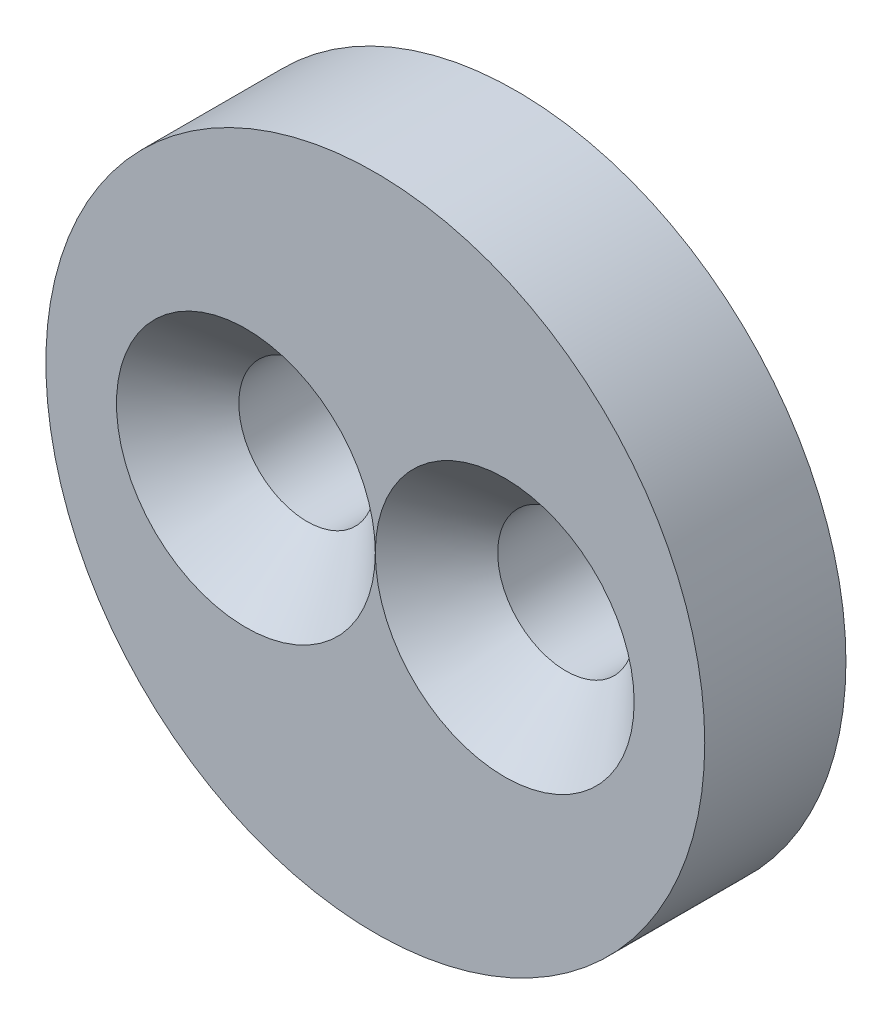
ISO-10303-21;
HEADER;
FILE_DESCRIPTION(('STEP AP214'),'2;1');
FILE_NAME('part.step','',(''),(''),'','','');
FILE_SCHEMA(('AUTOMOTIVE_DESIGN { 1 0 10303 214 1 1 1 1 }'));
ENDSEC;
DATA;
#1=APPLICATION_CONTEXT('core data for automotive mechanical design processes');
#2=APPLICATION_PROTOCOL_DEFINITION('international standard','automotive_design',2000,#1);
#3=PRODUCT_CONTEXT('',#1,'mechanical');
#4=PRODUCT('Part','Part','',(#3));
#5=PRODUCT_RELATED_PRODUCT_CATEGORY('part','',(#4));
#6=PRODUCT_DEFINITION_FORMATION('','',#4);
#7=PRODUCT_DEFINITION_CONTEXT('part definition',#1,'design');
#8=PRODUCT_DEFINITION('design','',#6,#7);
#9=PRODUCT_DEFINITION_SHAPE('','',#8);
#10=(LENGTH_UNIT() NAMED_UNIT(*) SI_UNIT(.MILLI.,.METRE.));
#11=(NAMED_UNIT(*) PLANE_ANGLE_UNIT() SI_UNIT($,.RADIAN.));
#12=(NAMED_UNIT(*) SI_UNIT($,.STERADIAN.) SOLID_ANGLE_UNIT());
#13=UNCERTAINTY_MEASURE_WITH_UNIT(LENGTH_MEASURE(1.E-05),#10,'distance_accuracy_value','');
#14=(GEOMETRIC_REPRESENTATION_CONTEXT(3) GLOBAL_UNCERTAINTY_ASSIGNED_CONTEXT((#13)) GLOBAL_UNIT_ASSIGNED_CONTEXT((#10,
#11,#12)) REPRESENTATION_CONTEXT('',''));
#15=CARTESIAN_POINT('',(0.,0.,0.));
#16=DIRECTION('',(0.,0.,1.));
#17=DIRECTION('',(1.,0.,0.));
#18=AXIS2_PLACEMENT_3D('',#15,#16,#17);
#19=CARTESIAN_POINT('',(0.,0.,30.299999999999));
#20=DIRECTION('',(0.,0.,-1.));
#21=DIRECTION('',(-1.,0.,0.));
#22=AXIS2_PLACEMENT_3D('',#19,#20,#21);
#23=CYLINDRICAL_SURFACE('',#22,7.);
#24=CARTESIAN_POINT('',(0.,0.,30.299999999999));
#25=DIRECTION('',(0.,0.,1.));
#26=DIRECTION('',(1.,0.,0.));
#27=AXIS2_PLACEMENT_3D('',#24,#25,#26);
#28=CIRCLE('',#27,7.);
#29=CARTESIAN_POINT('',(7.00000000000001,0.,30.299999999999));
#30=VERTEX_POINT('',#29);
#31=EDGE_CURVE('E11',#30,#30,#28,.T.);
#32=ORIENTED_EDGE('',*,*,#31,.F.);
#33=EDGE_LOOP('',(#32));
#34=FACE_BOUND('',#33,.T.);
#35=CARTESIAN_POINT('',(0.,0.,27.299999999999));
#36=DIRECTION('',(0.,0.,1.));
#37=DIRECTION('',(1.,0.,0.));
#38=AXIS2_PLACEMENT_3D('',#35,#36,#37);
#39=CIRCLE('',#38,7.);
#40=CARTESIAN_POINT('',(7.00000000000001,0.,27.299999999999));
#41=VERTEX_POINT('',#40);
#42=EDGE_CURVE('E42',#41,#41,#39,.T.);
#43=ORIENTED_EDGE('',*,*,#42,.T.);
#44=EDGE_LOOP('',(#43));
#45=FACE_BOUND('',#44,.T.);
#46=ADVANCED_FACE('F39',(#34,#45),#23,.T.);
#47=CARTESIAN_POINT('',(0.,0.,30.299999999999));
#48=DIRECTION('',(0.,0.,1.));
#49=DIRECTION('',(1.,0.,0.));
#50=AXIS2_PLACEMENT_3D('',#47,#48,#49);
#51=PLANE('',#50);
#52=CARTESIAN_POINT('',(2.74999999999782,3.33114472126336E-13,30.299999999999));
#53=DIRECTION('',(0.,0.,1.));
#54=DIRECTION('',(1.,0.,0.));
#55=AXIS2_PLACEMENT_3D('',#52,#53,#54);
#56=CIRCLE('',#55,2.75);
#57=CARTESIAN_POINT('',(-2.18141477104083E-12,3.30375110899629E-13,30.299999999999));
#58=VERTEX_POINT('',#57);
#59=EDGE_CURVE('E62',#58,#58,#56,.T.);
#60=ORIENTED_EDGE('',*,*,#59,.F.);
#61=CARTESIAN_POINT('',(-2.74999999999994,3.27039647746377E-13,30.299999999999));
#62=DIRECTION('',(0.,0.,1.));
#63=DIRECTION('',(1.,0.,0.));
#64=AXIS2_PLACEMENT_3D('',#61,#62,#63);
#65=CIRCLE('',#64,2.75);
#66=EDGE_CURVE('E49',#58,#58,#65,.T.);
#67=ORIENTED_EDGE('',*,*,#66,.F.);
#68=EDGE_LOOP('',(#60,#67));
#69=FACE_BOUND('',#68,.T.);
#70=ORIENTED_EDGE('',*,*,#31,.T.);
#71=EDGE_LOOP('',(#70));
#72=FACE_BOUND('',#71,.T.);
#73=ADVANCED_FACE('F78',(#69,#72),#51,.T.);
#74=CARTESIAN_POINT('',(0.,0.,27.299999999999));
#75=DIRECTION('',(0.,0.,1.));
#76=DIRECTION('',(1.,0.,0.));
#77=AXIS2_PLACEMENT_3D('',#74,#75,#76);
#78=PLANE('',#77);
#79=CARTESIAN_POINT('',(-2.74999999999994,3.27039647746377E-13,27.299999999999));
#80=DIRECTION('',(0.,0.,1.));
#81=DIRECTION('',(1.,0.,0.));
#82=AXIS2_PLACEMENT_3D('',#79,#80,#81);
#83=CIRCLE('',#82,1.45);
#84=CARTESIAN_POINT('',(-1.29999999999994,3.27039647746377E-13,27.299999999999));
#85=VERTEX_POINT('',#84);
#86=EDGE_CURVE('E57',#85,#85,#83,.T.);
#87=ORIENTED_EDGE('',*,*,#86,.T.);
#88=EDGE_LOOP('',(#87));
#89=FACE_BOUND('',#88,.T.);
#90=CARTESIAN_POINT('',(2.74999999999782,3.33114472126336E-13,27.299999999999));
#91=DIRECTION('',(0.,0.,1.));
#92=DIRECTION('',(1.,0.,0.));
#93=AXIS2_PLACEMENT_3D('',#90,#91,#92);
#94=CIRCLE('',#93,1.45);
#95=CARTESIAN_POINT('',(4.19999999999782,3.33114472126336E-13,27.299999999999));
#96=VERTEX_POINT('',#95);
#97=EDGE_CURVE('E67',#96,#96,#94,.T.);
#98=ORIENTED_EDGE('',*,*,#97,.T.);
#99=EDGE_LOOP('',(#98));
#100=FACE_BOUND('',#99,.T.);
#101=ORIENTED_EDGE('',*,*,#42,.F.);
#102=EDGE_LOOP('',(#101));
#103=FACE_BOUND('',#102,.T.);
#104=ADVANCED_FACE('F75',(#89,#100,#103),#78,.F.);
#105=CARTESIAN_POINT('',(2.74999999999782,3.33114472126336E-13,30.299999999999));
#106=DIRECTION('',(0.,0.,1.));
#107=DIRECTION('',(1.,0.,0.));
#108=AXIS2_PLACEMENT_3D('',#105,#106,#107);
#109=CYLINDRICAL_SURFACE('',#108,1.45);
#110=ORIENTED_EDGE('',*,*,#97,.F.);
#111=EDGE_LOOP('',(#110));
#112=FACE_BOUND('',#111,.T.);
#113=CARTESIAN_POINT('',(2.74999999999782,3.33114472126336E-13,28.999999999999));
#114=DIRECTION('',(0.,0.,1.));
#115=DIRECTION('',(1.,0.,0.));
#116=AXIS2_PLACEMENT_3D('',#113,#114,#115);
#117=CIRCLE('',#116,1.45);
#118=CARTESIAN_POINT('',(4.19999999999782,3.33114472126336E-13,28.999999999999));
#119=VERTEX_POINT('',#118);
#120=EDGE_CURVE('E64',#119,#119,#117,.T.);
#121=ORIENTED_EDGE('',*,*,#120,.T.);
#122=EDGE_LOOP('',(#121));
#123=FACE_BOUND('',#122,.T.);
#124=ADVANCED_FACE('F77',(#112,#123),#109,.F.);
#125=CARTESIAN_POINT('',(2.74999999999782,3.33114472126336E-13,30.299999999999));
#126=DIRECTION('',(0.,0.,1.));
#127=DIRECTION('',(1.,0.,0.));
#128=AXIS2_PLACEMENT_3D('',#125,#126,#127);
#129=CONICAL_SURFACE('',#128,2.75,0.785398163397448);
#130=ORIENTED_EDGE('',*,*,#120,.F.);
#131=EDGE_LOOP('',(#130));
#132=FACE_BOUND('',#131,.T.);
#133=ORIENTED_EDGE('',*,*,#59,.T.);
#134=EDGE_LOOP('',(#133));
#135=FACE_BOUND('',#134,.T.);
#136=ADVANCED_FACE('F84',(#132,#135),#129,.F.);
#137=CARTESIAN_POINT('',(-2.74999999999994,3.27039647746377E-13,30.299999999999));
#138=DIRECTION('',(0.,0.,1.));
#139=DIRECTION('',(1.,0.,0.));
#140=AXIS2_PLACEMENT_3D('',#137,#138,#139);
#141=CYLINDRICAL_SURFACE('',#140,1.45);
#142=ORIENTED_EDGE('',*,*,#86,.F.);
#143=EDGE_LOOP('',(#142));
#144=FACE_BOUND('',#143,.T.);
#145=CARTESIAN_POINT('',(-2.74999999999994,3.27039647746377E-13,28.999999999999));
#146=DIRECTION('',(0.,0.,1.));
#147=DIRECTION('',(1.,0.,0.));
#148=AXIS2_PLACEMENT_3D('',#145,#146,#147);
#149=CIRCLE('',#148,1.45);
#150=CARTESIAN_POINT('',(-1.29999999999994,3.27039647746377E-13,28.999999999999));
#151=VERTEX_POINT('',#150);
#152=EDGE_CURVE('E54',#151,#151,#149,.T.);
#153=ORIENTED_EDGE('',*,*,#152,.T.);
#154=EDGE_LOOP('',(#153));
#155=FACE_BOUND('',#154,.T.);
#156=ADVANCED_FACE('F119',(#144,#155),#141,.F.);
#157=CARTESIAN_POINT('',(-2.74999999999994,3.27039647746377E-13,30.299999999999));
#158=DIRECTION('',(0.,0.,1.));
#159=DIRECTION('',(1.,0.,0.));
#160=AXIS2_PLACEMENT_3D('',#157,#158,#159);
#161=CONICAL_SURFACE('',#160,2.75,0.785398163397447);
#162=ORIENTED_EDGE('',*,*,#152,.F.);
#163=EDGE_LOOP('',(#162));
#164=FACE_BOUND('',#163,.T.);
#165=ORIENTED_EDGE('',*,*,#66,.T.);
#166=EDGE_LOOP('',(#165));
#167=FACE_BOUND('',#166,.T.);
#168=ADVANCED_FACE('F50',(#164,#167),#161,.F.);
#169=CLOSED_SHELL('',(#46,#73,#104,#124,#136,#156,#168));
#170=MANIFOLD_SOLID_BREP('B2',#169);
#171=ADVANCED_BREP_SHAPE_REPRESENTATION('',(#18,#170),#14);
#172=SHAPE_DEFINITION_REPRESENTATION(#9,#171);
ENDSEC;
END-ISO-10303-21;
